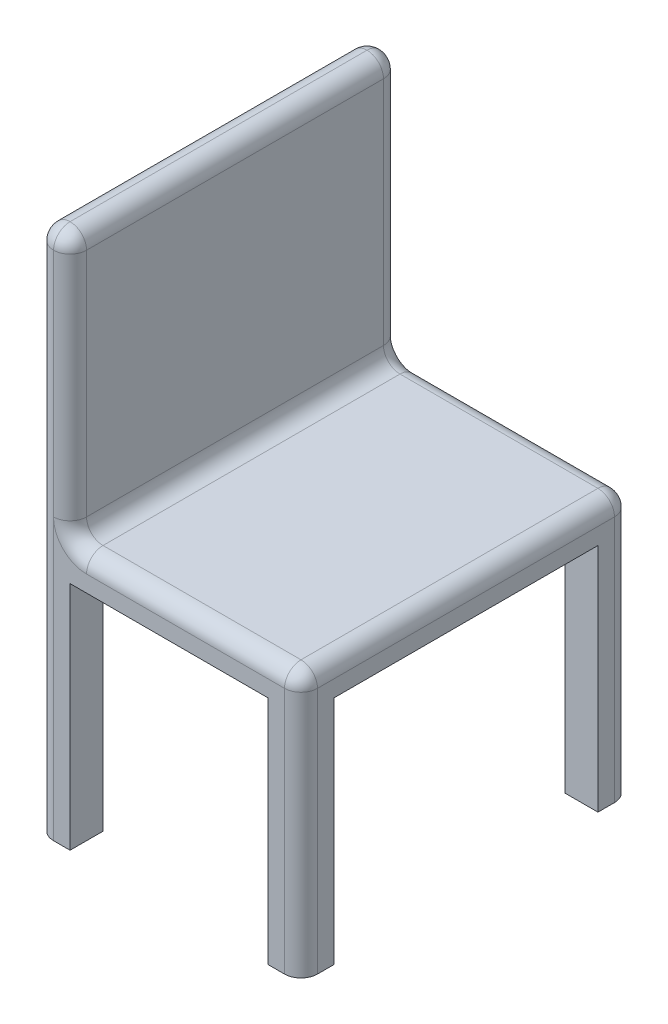
ISO-10303-21;
HEADER;
FILE_DESCRIPTION(('STEP AP214'),'2;1');
FILE_NAME('part.step','',(''),(''),'','','');
FILE_SCHEMA(('AUTOMOTIVE_DESIGN { 1 0 10303 214 1 1 1 1 }'));
ENDSEC;
DATA;
#1=APPLICATION_CONTEXT('core data for automotive mechanical design processes');
#2=APPLICATION_PROTOCOL_DEFINITION('international standard','automotive_design',2000,#1);
#3=PRODUCT_CONTEXT('',#1,'mechanical');
#4=PRODUCT('Part','Part','',(#3));
#5=PRODUCT_RELATED_PRODUCT_CATEGORY('part','',(#4));
#6=PRODUCT_DEFINITION_FORMATION('','',#4);
#7=PRODUCT_DEFINITION_CONTEXT('part definition',#1,'design');
#8=PRODUCT_DEFINITION('design','',#6,#7);
#9=PRODUCT_DEFINITION_SHAPE('','',#8);
#10=(LENGTH_UNIT() NAMED_UNIT(*) SI_UNIT(.MILLI.,.METRE.));
#11=(NAMED_UNIT(*) PLANE_ANGLE_UNIT() SI_UNIT($,.RADIAN.));
#12=(NAMED_UNIT(*) SI_UNIT($,.STERADIAN.) SOLID_ANGLE_UNIT());
#13=UNCERTAINTY_MEASURE_WITH_UNIT(LENGTH_MEASURE(1.E-05),#10,'distance_accuracy_value','');
#14=(GEOMETRIC_REPRESENTATION_CONTEXT(3) GLOBAL_UNCERTAINTY_ASSIGNED_CONTEXT((#13)) GLOBAL_UNIT_ASSIGNED_CONTEXT((#10,
#11,#12)) REPRESENTATION_CONTEXT('',''));
#15=CARTESIAN_POINT('',(0.,0.,0.));
#16=DIRECTION('',(0.,0.,1.));
#17=DIRECTION('',(1.,0.,0.));
#18=AXIS2_PLACEMENT_3D('',#15,#16,#17);
#19=CARTESIAN_POINT('',(1.,0.,10.));
#20=DIRECTION('',(0.,1.,0.));
#21=DIRECTION('',(-1.,0.,0.));
#22=AXIS2_PLACEMENT_3D('',#19,#20,#21);
#23=PLANE('',#22);
#24=DIRECTION('',(1.,0.,0.));
#25=VECTOR('',#24,1.);
#26=CARTESIAN_POINT('',(1.,0.,10.));
#27=LINE('',#26,#25);
#28=CARTESIAN_POINT('',(0.5,0.,10.));
#29=VERTEX_POINT('',#28);
#30=CARTESIAN_POINT('',(1.,0.,10.));
#31=VERTEX_POINT('',#30);
#32=EDGE_CURVE('E281',#29,#31,#27,.T.);
#33=ORIENTED_EDGE('',*,*,#32,.F.);
#34=CARTESIAN_POINT('',(0.5,0.,9.5));
#35=DIRECTION('',(0.,1.,0.));
#36=DIRECTION('',(-1.,0.,0.));
#37=AXIS2_PLACEMENT_3D('',#34,#35,#36);
#38=CIRCLE('',#37,0.5);
#39=CARTESIAN_POINT('',(0.,0.,9.5));
#40=VERTEX_POINT('',#39);
#41=EDGE_CURVE('E224',#29,#40,#38,.F.);
#42=ORIENTED_EDGE('',*,*,#41,.T.);
#43=DIRECTION('',(0.,0.,-1.));
#44=VECTOR('',#43,1.);
#45=CARTESIAN_POINT('',(0.,0.,10.));
#46=LINE('',#45,#44);
#47=CARTESIAN_POINT('',(0.,0.,9.));
#48=VERTEX_POINT('',#47);
#49=EDGE_CURVE('E217',#40,#48,#46,.T.);
#50=ORIENTED_EDGE('',*,*,#49,.T.);
#51=DIRECTION('',(1.,0.,0.));
#52=VECTOR('',#51,1.);
#53=CARTESIAN_POINT('',(0.,0.,9.));
#54=LINE('',#53,#52);
#55=CARTESIAN_POINT('',(1.,0.,9.));
#56=VERTEX_POINT('',#55);
#57=EDGE_CURVE('E221',#48,#56,#54,.T.);
#58=ORIENTED_EDGE('',*,*,#57,.T.);
#59=DIRECTION('',(0.,0.,-1.));
#60=VECTOR('',#59,1.);
#61=CARTESIAN_POINT('',(1.,0.,10.));
#62=LINE('',#61,#60);
#63=EDGE_CURVE('E320',#31,#56,#62,.T.);
#64=ORIENTED_EDGE('',*,*,#63,.F.);
#65=EDGE_LOOP('',(#33,#42,#50,#58,#64));
#66=FACE_BOUND('',#65,.T.);
#67=ADVANCED_FACE('F37',(#66),#23,.F.);
#68=CARTESIAN_POINT('',(1.,7.,10.));
#69=DIRECTION('',(-1.,0.,0.));
#70=DIRECTION('',(0.,-1.,0.));
#71=AXIS2_PLACEMENT_3D('',#68,#69,#70);
#72=PLANE('',#71);
#73=ORIENTED_EDGE('',*,*,#63,.T.);
#74=DIRECTION('',(0.,1.,0.));
#75=VECTOR('',#74,1.);
#76=CARTESIAN_POINT('',(1.,7.,9.));
#77=LINE('',#76,#75);
#78=CARTESIAN_POINT('',(1.,7.,9.));
#79=VERTEX_POINT('',#78);
#80=EDGE_CURVE('E238',#56,#79,#77,.T.);
#81=ORIENTED_EDGE('',*,*,#80,.T.);
#82=DIRECTION('',(0.,0.,-1.));
#83=VECTOR('',#82,1.);
#84=CARTESIAN_POINT('',(1.,7.,10.));
#85=LINE('',#84,#83);
#86=CARTESIAN_POINT('',(1.,7.,10.));
#87=VERTEX_POINT('',#86);
#88=EDGE_CURVE('E316',#87,#79,#85,.T.);
#89=ORIENTED_EDGE('',*,*,#88,.F.);
#90=DIRECTION('',(0.,1.,0.));
#91=VECTOR('',#90,1.);
#92=CARTESIAN_POINT('',(1.,7.,10.));
#93=LINE('',#92,#91);
#94=EDGE_CURVE('E283',#31,#87,#93,.T.);
#95=ORIENTED_EDGE('',*,*,#94,.F.);
#96=EDGE_LOOP('',(#73,#81,#89,#95));
#97=FACE_BOUND('',#96,.T.);
#98=ADVANCED_FACE('F476',(#97),#72,.F.);
#99=CARTESIAN_POINT('',(7.,0.,10.));
#100=DIRECTION('',(1.,0.,0.));
#101=DIRECTION('',(0.,0.,-1.));
#102=AXIS2_PLACEMENT_3D('',#99,#100,#101);
#103=PLANE('',#102);
#104=DIRECTION('',(0.,0.,-1.));
#105=VECTOR('',#104,1.);
#106=CARTESIAN_POINT('',(7.,7.,10.));
#107=LINE('',#106,#105);
#108=CARTESIAN_POINT('',(7.,7.,10.));
#109=VERTEX_POINT('',#108);
#110=CARTESIAN_POINT('',(7.,7.,9.));
#111=VERTEX_POINT('',#110);
#112=EDGE_CURVE('E312',#109,#111,#107,.T.);
#113=ORIENTED_EDGE('',*,*,#112,.T.);
#114=DIRECTION('',(0.,-1.,0.));
#115=VECTOR('',#114,1.);
#116=CARTESIAN_POINT('',(7.,0.,9.));
#117=LINE('',#116,#115);
#118=CARTESIAN_POINT('',(7.,0.,9.));
#119=VERTEX_POINT('',#118);
#120=EDGE_CURVE('E276',#111,#119,#117,.T.);
#121=ORIENTED_EDGE('',*,*,#120,.T.);
#122=DIRECTION('',(0.,0.,-1.));
#123=VECTOR('',#122,1.);
#124=CARTESIAN_POINT('',(7.,0.,10.));
#125=LINE('',#124,#123);
#126=CARTESIAN_POINT('',(7.,0.,10.));
#127=VERTEX_POINT('',#126);
#128=EDGE_CURVE('E308',#127,#119,#125,.T.);
#129=ORIENTED_EDGE('',*,*,#128,.F.);
#130=DIRECTION('',(0.,-1.,0.));
#131=VECTOR('',#130,1.);
#132=CARTESIAN_POINT('',(7.,0.,10.));
#133=LINE('',#132,#131);
#134=EDGE_CURVE('E288',#109,#127,#133,.T.);
#135=ORIENTED_EDGE('',*,*,#134,.F.);
#136=EDGE_LOOP('',(#113,#121,#129,#135));
#137=FACE_BOUND('',#136,.T.);
#138=ADVANCED_FACE('F482',(#137),#103,.F.);
#139=CARTESIAN_POINT('',(8.,0.,10.));
#140=DIRECTION('',(0.,1.,0.));
#141=DIRECTION('',(-1.,0.,0.));
#142=AXIS2_PLACEMENT_3D('',#139,#140,#141);
#143=PLANE('',#142);
#144=DIRECTION('',(0.,0.,-1.));
#145=VECTOR('',#144,1.);
#146=CARTESIAN_POINT('',(8.,0.,10.));
#147=LINE('',#146,#145);
#148=CARTESIAN_POINT('',(8.,0.,9.5));
#149=VERTEX_POINT('',#148);
#150=CARTESIAN_POINT('',(8.,0.,9.));
#151=VERTEX_POINT('',#150);
#152=EDGE_CURVE('E305',#149,#151,#147,.T.);
#153=ORIENTED_EDGE('',*,*,#152,.F.);
#154=CARTESIAN_POINT('',(7.5,0.,9.5));
#155=DIRECTION('',(0.,1.,0.));
#156=DIRECTION('',(-1.,0.,0.));
#157=AXIS2_PLACEMENT_3D('',#154,#155,#156);
#158=CIRCLE('',#157,0.5);
#159=CARTESIAN_POINT('',(7.5,0.,10.));
#160=VERTEX_POINT('',#159);
#161=EDGE_CURVE('E410',#149,#160,#158,.F.);
#162=ORIENTED_EDGE('',*,*,#161,.T.);
#163=DIRECTION('',(1.,0.,0.));
#164=VECTOR('',#163,1.);
#165=CARTESIAN_POINT('',(8.,0.,10.));
#166=LINE('',#165,#164);
#167=EDGE_CURVE('E290',#127,#160,#166,.T.);
#168=ORIENTED_EDGE('',*,*,#167,.F.);
#169=ORIENTED_EDGE('',*,*,#128,.T.);
#170=EDGE_CURVE('E240',#119,#151,#54,.T.);
#171=ORIENTED_EDGE('',*,*,#170,.T.);
#172=EDGE_LOOP('',(#153,#162,#168,#169,#171));
#173=FACE_BOUND('',#172,.T.);
#174=ADVANCED_FACE('F488',(#173),#143,.F.);
#175=CARTESIAN_POINT('',(0.,0.,1.));
#176=VERTEX_POINT('',#175);
#177=CARTESIAN_POINT('',(0.,0.,0.5));
#178=VERTEX_POINT('',#177);
#179=EDGE_CURVE('E230',#176,#178,#46,.T.);
#180=ORIENTED_EDGE('',*,*,#179,.T.);
#181=CARTESIAN_POINT('',(0.5,0.,0.5));
#182=DIRECTION('',(0.,1.,0.));
#183=DIRECTION('',(-1.,0.,0.));
#184=AXIS2_PLACEMENT_3D('',#181,#182,#183);
#185=CIRCLE('',#184,0.5);
#186=CARTESIAN_POINT('',(0.5,0.,0.));
#187=VERTEX_POINT('',#186);
#188=EDGE_CURVE('E394',#178,#187,#185,.F.);
#189=ORIENTED_EDGE('',*,*,#188,.T.);
#190=DIRECTION('',(1.,0.,0.));
#191=VECTOR('',#190,1.);
#192=CARTESIAN_POINT('',(1.,0.,0.));
#193=LINE('',#192,#191);
#194=CARTESIAN_POINT('',(1.,0.,0.));
#195=VERTEX_POINT('',#194);
#196=EDGE_CURVE('E280',#187,#195,#193,.T.);
#197=ORIENTED_EDGE('',*,*,#196,.T.);
#198=CARTESIAN_POINT('',(1.,0.,1.));
#199=VERTEX_POINT('',#198);
#200=EDGE_CURVE('E319',#199,#195,#62,.T.);
#201=ORIENTED_EDGE('',*,*,#200,.F.);
#202=DIRECTION('',(1.,0.,0.));
#203=VECTOR('',#202,1.);
#204=CARTESIAN_POINT('',(0.,0.,1.));
#205=LINE('',#204,#203);
#206=EDGE_CURVE('E269',#176,#199,#205,.T.);
#207=ORIENTED_EDGE('',*,*,#206,.F.);
#208=EDGE_LOOP('',(#180,#189,#197,#201,#207));
#209=FACE_BOUND('',#208,.T.);
#210=ADVANCED_FACE('F478',(#209),#23,.F.);
#211=CARTESIAN_POINT('',(1.,7.,1.));
#212=VERTEX_POINT('',#211);
#213=CARTESIAN_POINT('',(1.,7.,0.));
#214=VERTEX_POINT('',#213);
#215=EDGE_CURVE('E315',#212,#214,#85,.T.);
#216=ORIENTED_EDGE('',*,*,#215,.F.);
#217=DIRECTION('',(0.,-1.,0.));
#218=VECTOR('',#217,1.);
#219=CARTESIAN_POINT('',(1.,7.,1.));
#220=LINE('',#219,#218);
#221=EDGE_CURVE('E273',#212,#199,#220,.T.);
#222=ORIENTED_EDGE('',*,*,#221,.T.);
#223=ORIENTED_EDGE('',*,*,#200,.T.);
#224=DIRECTION('',(0.,1.,0.));
#225=VECTOR('',#224,1.);
#226=CARTESIAN_POINT('',(1.,7.,0.));
#227=LINE('',#226,#225);
#228=EDGE_CURVE('E294',#195,#214,#227,.T.);
#229=ORIENTED_EDGE('',*,*,#228,.T.);
#230=EDGE_LOOP('',(#216,#222,#223,#229));
#231=FACE_BOUND('',#230,.T.);
#232=ADVANCED_FACE('F485',(#231),#72,.F.);
#233=CARTESIAN_POINT('',(7.,7.,10.));
#234=DIRECTION('',(0.,1.,0.));
#235=DIRECTION('',(-1.,0.,0.));
#236=AXIS2_PLACEMENT_3D('',#233,#234,#235);
#237=PLANE('',#236);
#238=CARTESIAN_POINT('',(7.,7.,1.));
#239=VERTEX_POINT('',#238);
#240=CARTESIAN_POINT('',(7.,7.,0.));
#241=VERTEX_POINT('',#240);
#242=EDGE_CURVE('E311',#239,#241,#107,.T.);
#243=ORIENTED_EDGE('',*,*,#242,.F.);
#244=DIRECTION('',(1.,0.,0.));
#245=VECTOR('',#244,1.);
#246=CARTESIAN_POINT('',(0.,7.,1.));
#247=LINE('',#246,#245);
#248=CARTESIAN_POINT('',(8.,7.,1.));
#249=VERTEX_POINT('',#248);
#250=EDGE_CURVE('E268',#239,#249,#247,.T.);
#251=ORIENTED_EDGE('',*,*,#250,.T.);
#252=DIRECTION('',(0.,0.,1.));
#253=VECTOR('',#252,1.);
#254=CARTESIAN_POINT('',(8.,7.,9.));
#255=LINE('',#254,#253);
#256=CARTESIAN_POINT('',(8.,7.,9.));
#257=VERTEX_POINT('',#256);
#258=EDGE_CURVE('E247',#249,#257,#255,.T.);
#259=ORIENTED_EDGE('',*,*,#258,.T.);
#260=DIRECTION('',(1.,0.,0.));
#261=VECTOR('',#260,1.);
#262=CARTESIAN_POINT('',(0.,7.,9.));
#263=LINE('',#262,#261);
#264=EDGE_CURVE('E264',#111,#257,#263,.T.);
#265=ORIENTED_EDGE('',*,*,#264,.F.);
#266=ORIENTED_EDGE('',*,*,#112,.F.);
#267=DIRECTION('',(1.,0.,0.));
#268=VECTOR('',#267,1.);
#269=CARTESIAN_POINT('',(7.,7.,10.));
#270=LINE('',#269,#268);
#271=EDGE_CURVE('E286',#87,#109,#270,.T.);
#272=ORIENTED_EDGE('',*,*,#271,.F.);
#273=ORIENTED_EDGE('',*,*,#88,.T.);
#274=CARTESIAN_POINT('',(0.,7.,9.));
#275=VERTEX_POINT('',#274);
#276=EDGE_CURVE('E261',#275,#79,#263,.T.);
#277=ORIENTED_EDGE('',*,*,#276,.F.);
#278=DIRECTION('',(0.,0.,1.));
#279=VECTOR('',#278,1.);
#280=CARTESIAN_POINT('',(0.,7.,9.));
#281=LINE('',#280,#279);
#282=CARTESIAN_POINT('',(0.,7.,1.));
#283=VERTEX_POINT('',#282);
#284=EDGE_CURVE('E245',#283,#275,#281,.T.);
#285=ORIENTED_EDGE('',*,*,#284,.F.);
#286=EDGE_CURVE('E265',#283,#212,#247,.T.);
#287=ORIENTED_EDGE('',*,*,#286,.T.);
#288=ORIENTED_EDGE('',*,*,#215,.T.);
#289=DIRECTION('',(1.,0.,0.));
#290=VECTOR('',#289,1.);
#291=CARTESIAN_POINT('',(7.,7.,0.));
#292=LINE('',#291,#290);
#293=EDGE_CURVE('E297',#214,#241,#292,.T.);
#294=ORIENTED_EDGE('',*,*,#293,.T.);
#295=EDGE_LOOP('',(#243,#251,#259,#265,#266,#272,#273,#277,#285,#287,#288,#294));
#296=FACE_BOUND('',#295,.T.);
#297=ADVANCED_FACE('F494',(#296),#237,.F.);
#298=CARTESIAN_POINT('',(7.,0.,1.));
#299=VERTEX_POINT('',#298);
#300=CARTESIAN_POINT('',(7.,0.,0.));
#301=VERTEX_POINT('',#300);
#302=EDGE_CURVE('E307',#299,#301,#125,.T.);
#303=ORIENTED_EDGE('',*,*,#302,.F.);
#304=DIRECTION('',(0.,1.,0.));
#305=VECTOR('',#304,1.);
#306=CARTESIAN_POINT('',(7.,0.,1.));
#307=LINE('',#306,#305);
#308=EDGE_CURVE('E263',#299,#239,#307,.T.);
#309=ORIENTED_EDGE('',*,*,#308,.T.);
#310=ORIENTED_EDGE('',*,*,#242,.T.);
#311=DIRECTION('',(0.,-1.,0.));
#312=VECTOR('',#311,1.);
#313=CARTESIAN_POINT('',(7.,0.,0.));
#314=LINE('',#313,#312);
#315=EDGE_CURVE('E300',#241,#301,#314,.T.);
#316=ORIENTED_EDGE('',*,*,#315,.T.);
#317=EDGE_LOOP('',(#303,#309,#310,#316));
#318=FACE_BOUND('',#317,.T.);
#319=ADVANCED_FACE('F517',(#318),#103,.F.);
#320=DIRECTION('',(1.,0.,0.));
#321=VECTOR('',#320,1.);
#322=CARTESIAN_POINT('',(8.,0.,0.));
#323=LINE('',#322,#321);
#324=CARTESIAN_POINT('',(7.5,0.,0.));
#325=VERTEX_POINT('',#324);
#326=EDGE_CURVE('E284',#301,#325,#323,.T.);
#327=ORIENTED_EDGE('',*,*,#326,.T.);
#328=CARTESIAN_POINT('',(7.5,0.,0.5));
#329=DIRECTION('',(0.,1.,0.));
#330=DIRECTION('',(-1.,0.,0.));
#331=AXIS2_PLACEMENT_3D('',#328,#329,#330);
#332=CIRCLE('',#331,0.5);
#333=CARTESIAN_POINT('',(8.,0.,0.5));
#334=VERTEX_POINT('',#333);
#335=EDGE_CURVE('E412',#325,#334,#332,.F.);
#336=ORIENTED_EDGE('',*,*,#335,.T.);
#337=CARTESIAN_POINT('',(8.,0.,1.));
#338=VERTEX_POINT('',#337);
#339=EDGE_CURVE('E229',#338,#334,#147,.T.);
#340=ORIENTED_EDGE('',*,*,#339,.F.);
#341=EDGE_CURVE('E239',#299,#338,#205,.T.);
#342=ORIENTED_EDGE('',*,*,#341,.F.);
#343=ORIENTED_EDGE('',*,*,#302,.T.);
#344=EDGE_LOOP('',(#327,#336,#340,#342,#343));
#345=FACE_BOUND('',#344,.T.);
#346=ADVANCED_FACE('F498',(#345),#143,.F.);
#347=CARTESIAN_POINT('',(8.,8.,10.));
#348=DIRECTION('',(-1.,0.,0.));
#349=DIRECTION('',(0.,-1.,0.));
#350=AXIS2_PLACEMENT_3D('',#347,#348,#349);
#351=PLANE('',#350);
#352=DIRECTION('',(0.,0.,-1.));
#353=VECTOR('',#352,1.);
#354=CARTESIAN_POINT('',(8.,7.5,10.));
#355=LINE('',#354,#353);
#356=CARTESIAN_POINT('',(8.,7.5,0.5));
#357=VERTEX_POINT('',#356);
#358=CARTESIAN_POINT('',(8.,7.5,9.5));
#359=VERTEX_POINT('',#358);
#360=EDGE_CURVE('E354',#357,#359,#355,.F.);
#361=ORIENTED_EDGE('',*,*,#360,.T.);
#362=DIRECTION('',(0.,1.,0.));
#363=VECTOR('',#362,1.);
#364=CARTESIAN_POINT('',(8.,8.,9.5));
#365=LINE('',#364,#363);
#366=EDGE_CURVE('E408',#359,#149,#365,.F.);
#367=ORIENTED_EDGE('',*,*,#366,.T.);
#368=ORIENTED_EDGE('',*,*,#152,.T.);
#369=DIRECTION('',(0.,-1.,0.));
#370=VECTOR('',#369,1.);
#371=CARTESIAN_POINT('',(8.,0.,9.));
#372=LINE('',#371,#370);
#373=EDGE_CURVE('E255',#257,#151,#372,.T.);
#374=ORIENTED_EDGE('',*,*,#373,.F.);
#375=ORIENTED_EDGE('',*,*,#258,.F.);
#376=DIRECTION('',(0.,1.,0.));
#377=VECTOR('',#376,1.);
#378=CARTESIAN_POINT('',(8.,0.,1.));
#379=LINE('',#378,#377);
#380=EDGE_CURVE('E251',#338,#249,#379,.T.);
#381=ORIENTED_EDGE('',*,*,#380,.F.);
#382=ORIENTED_EDGE('',*,*,#339,.T.);
#383=DIRECTION('',(0.,1.,0.));
#384=VECTOR('',#383,1.);
#385=CARTESIAN_POINT('',(8.,7.5,0.5));
#386=LINE('',#385,#384);
#387=EDGE_CURVE('E406',#334,#357,#386,.T.);
#388=ORIENTED_EDGE('',*,*,#387,.T.);
#389=EDGE_LOOP('',(#361,#367,#368,#374,#375,#381,#382,#388));
#390=FACE_BOUND('',#389,.T.);
#391=ADVANCED_FACE('F528',(#390),#351,.F.);
#392=CARTESIAN_POINT('',(1.,8.,10.));
#393=DIRECTION('',(0.,-1.,0.));
#394=DIRECTION('',(0.,0.,-1.));
#395=AXIS2_PLACEMENT_3D('',#392,#393,#394);
#396=PLANE('',#395);
#397=DIRECTION('',(0.,0.,-1.));
#398=VECTOR('',#397,1.);
#399=CARTESIAN_POINT('',(1.5,8.,10.));
#400=LINE('',#399,#398);
#401=CARTESIAN_POINT('',(1.5,8.,0.5));
#402=VERTEX_POINT('',#401);
#403=CARTESIAN_POINT('',(1.5,8.,9.5));
#404=VERTEX_POINT('',#403);
#405=EDGE_CURVE('E349',#402,#404,#400,.F.);
#406=ORIENTED_EDGE('',*,*,#405,.T.);
#407=DIRECTION('',(-1.,0.,0.));
#408=VECTOR('',#407,1.);
#409=CARTESIAN_POINT('',(1.,8.,9.5));
#410=LINE('',#409,#408);
#411=CARTESIAN_POINT('',(7.5,8.,9.5));
#412=VERTEX_POINT('',#411);
#413=EDGE_CURVE('E351',#404,#412,#410,.F.);
#414=ORIENTED_EDGE('',*,*,#413,.T.);
#415=DIRECTION('',(0.,0.,-1.));
#416=VECTOR('',#415,1.);
#417=CARTESIAN_POINT('',(7.5,8.,10.));
#418=LINE('',#417,#416);
#419=CARTESIAN_POINT('',(7.5,8.,0.5));
#420=VERTEX_POINT('',#419);
#421=EDGE_CURVE('E346',#412,#420,#418,.T.);
#422=ORIENTED_EDGE('',*,*,#421,.T.);
#423=DIRECTION('',(-1.,0.,0.));
#424=VECTOR('',#423,1.);
#425=CARTESIAN_POINT('',(1.,8.,0.5));
#426=LINE('',#425,#424);
#427=EDGE_CURVE('E344',#420,#402,#426,.T.);
#428=ORIENTED_EDGE('',*,*,#427,.T.);
#429=EDGE_LOOP('',(#406,#414,#422,#428));
#430=FACE_BOUND('',#429,.T.);
#431=ADVANCED_FACE('F543',(#430),#396,.F.);
#432=CARTESIAN_POINT('',(1.,16.,10.));
#433=DIRECTION('',(-1.,0.,0.));
#434=DIRECTION('',(0.,-1.,0.));
#435=AXIS2_PLACEMENT_3D('',#432,#433,#434);
#436=PLANE('',#435);
#437=DIRECTION('',(0.,1.,0.));
#438=VECTOR('',#437,1.);
#439=CARTESIAN_POINT('',(1.,16.,0.5));
#440=LINE('',#439,#438);
#441=CARTESIAN_POINT('',(1.,8.5,0.5));
#442=VERTEX_POINT('',#441);
#443=CARTESIAN_POINT('',(1.,15.5,0.5));
#444=VERTEX_POINT('',#443);
#445=EDGE_CURVE('E332',#442,#444,#440,.T.);
#446=ORIENTED_EDGE('',*,*,#445,.T.);
#447=DIRECTION('',(0.,0.,-1.));
#448=VECTOR('',#447,1.);
#449=CARTESIAN_POINT('',(1.,15.5,10.));
#450=LINE('',#449,#448);
#451=CARTESIAN_POINT('',(1.,15.5,9.5));
#452=VERTEX_POINT('',#451);
#453=EDGE_CURVE('E428',#444,#452,#450,.F.);
#454=ORIENTED_EDGE('',*,*,#453,.T.);
#455=DIRECTION('',(0.,1.,0.));
#456=VECTOR('',#455,1.);
#457=CARTESIAN_POINT('',(1.,16.,9.5));
#458=LINE('',#457,#456);
#459=CARTESIAN_POINT('',(1.,8.5,9.5));
#460=VERTEX_POINT('',#459);
#461=EDGE_CURVE('E334',#452,#460,#458,.F.);
#462=ORIENTED_EDGE('',*,*,#461,.T.);
#463=DIRECTION('',(0.,0.,-1.));
#464=VECTOR('',#463,1.);
#465=CARTESIAN_POINT('',(1.,8.5,0.));
#466=LINE('',#465,#464);
#467=EDGE_CURVE('E330',#460,#442,#466,.T.);
#468=ORIENTED_EDGE('',*,*,#467,.T.);
#469=EDGE_LOOP('',(#446,#454,#462,#468));
#470=FACE_BOUND('',#469,.T.);
#471=ADVANCED_FACE('F594',(#470),#436,.F.);
#472=CARTESIAN_POINT('',(0.,0.,10.));
#473=DIRECTION('',(1.,0.,0.));
#474=DIRECTION('',(0.,0.,-1.));
#475=AXIS2_PLACEMENT_3D('',#472,#473,#474);
#476=PLANE('',#475);
#477=DIRECTION('',(0.,0.,-1.));
#478=VECTOR('',#477,1.);
#479=CARTESIAN_POINT('',(0.,15.5,10.));
#480=LINE('',#479,#478);
#481=CARTESIAN_POINT('',(0.,15.5,9.5));
#482=VERTEX_POINT('',#481);
#483=CARTESIAN_POINT('',(0.,15.5,0.5));
#484=VERTEX_POINT('',#483);
#485=EDGE_CURVE('E387',#482,#484,#480,.T.);
#486=ORIENTED_EDGE('',*,*,#485,.T.);
#487=DIRECTION('',(0.,-1.,0.));
#488=VECTOR('',#487,1.);
#489=CARTESIAN_POINT('',(0.,0.,0.5));
#490=LINE('',#489,#488);
#491=EDGE_CURVE('E389',#484,#178,#490,.T.);
#492=ORIENTED_EDGE('',*,*,#491,.T.);
#493=ORIENTED_EDGE('',*,*,#179,.F.);
#494=DIRECTION('',(0.,1.,0.));
#495=VECTOR('',#494,1.);
#496=CARTESIAN_POINT('',(0.,0.,1.));
#497=LINE('',#496,#495);
#498=EDGE_CURVE('E246',#176,#283,#497,.T.);
#499=ORIENTED_EDGE('',*,*,#498,.T.);
#500=ORIENTED_EDGE('',*,*,#284,.T.);
#501=DIRECTION('',(0.,-1.,0.));
#502=VECTOR('',#501,1.);
#503=CARTESIAN_POINT('',(0.,0.,9.));
#504=LINE('',#503,#502);
#505=EDGE_CURVE('E235',#275,#48,#504,.T.);
#506=ORIENTED_EDGE('',*,*,#505,.T.);
#507=ORIENTED_EDGE('',*,*,#49,.F.);
#508=DIRECTION('',(0.,-1.,0.));
#509=VECTOR('',#508,1.);
#510=CARTESIAN_POINT('',(0.,0.,9.5));
#511=LINE('',#510,#509);
#512=EDGE_CURVE('E385',#40,#482,#511,.F.);
#513=ORIENTED_EDGE('',*,*,#512,.T.);
#514=EDGE_LOOP('',(#486,#492,#493,#499,#500,#506,#507,#513));
#515=FACE_BOUND('',#514,.T.);
#516=ADVANCED_FACE('F243',(#515),#476,.F.);
#517=CARTESIAN_POINT('',(0.,0.,10.));
#518=DIRECTION('',(0.,0.,-1.));
#519=DIRECTION('',(-1.,0.,0.));
#520=AXIS2_PLACEMENT_3D('',#517,#518,#519);
#521=PLANE('',#520);
#522=CARTESIAN_POINT('',(1.5,8.5,10.));
#523=DIRECTION('',(0.,0.,-1.));
#524=DIRECTION('',(-1.,0.,0.));
#525=AXIS2_PLACEMENT_3D('',#522,#523,#524);
#526=CIRCLE('',#525,1.);
#527=CARTESIAN_POINT('',(0.500000000000001,8.5,10.));
#528=VERTEX_POINT('',#527);
#529=CARTESIAN_POINT('',(1.5,7.5,10.));
#530=VERTEX_POINT('',#529);
#531=EDGE_CURVE('E322',#528,#530,#526,.F.);
#532=ORIENTED_EDGE('',*,*,#531,.F.);
#533=DIRECTION('',(0.,-1.,0.));
#534=VECTOR('',#533,1.);
#535=CARTESIAN_POINT('',(0.5,0.,10.));
#536=LINE('',#535,#534);
#537=EDGE_CURVE('E403',#528,#29,#536,.T.);
#538=ORIENTED_EDGE('',*,*,#537,.T.);
#539=ORIENTED_EDGE('',*,*,#32,.T.);
#540=ORIENTED_EDGE('',*,*,#94,.T.);
#541=ORIENTED_EDGE('',*,*,#271,.T.);
#542=ORIENTED_EDGE('',*,*,#134,.T.);
#543=ORIENTED_EDGE('',*,*,#167,.T.);
#544=DIRECTION('',(0.,1.,0.));
#545=VECTOR('',#544,1.);
#546=CARTESIAN_POINT('',(7.5,0.,10.));
#547=LINE('',#546,#545);
#548=CARTESIAN_POINT('',(7.5,7.5,10.));
#549=VERTEX_POINT('',#548);
#550=EDGE_CURVE('E401',#160,#549,#547,.T.);
#551=ORIENTED_EDGE('',*,*,#550,.T.);
#552=DIRECTION('',(-1.,0.,0.));
#553=VECTOR('',#552,1.);
#554=CARTESIAN_POINT('',(0.,7.5,10.));
#555=LINE('',#554,#553);
#556=EDGE_CURVE('E325',#549,#530,#555,.T.);
#557=ORIENTED_EDGE('',*,*,#556,.T.);
#558=EDGE_LOOP('',(#532,#538,#539,#540,#541,#542,#543,#551,#557));
#559=FACE_BOUND('',#558,.T.);
#560=ADVANCED_FACE('F575',(#559),#521,.F.);
#561=CARTESIAN_POINT('',(0.,0.,0.));
#562=DIRECTION('',(0.,0.,-1.));
#563=DIRECTION('',(-1.,0.,0.));
#564=AXIS2_PLACEMENT_3D('',#561,#562,#563);
#565=PLANE('',#564);
#566=ORIENTED_EDGE('',*,*,#196,.F.);
#567=DIRECTION('',(0.,-1.,0.));
#568=VECTOR('',#567,1.);
#569=CARTESIAN_POINT('',(0.5,16.,0.));
#570=LINE('',#569,#568);
#571=CARTESIAN_POINT('',(0.500000000000001,8.5,0.));
#572=VERTEX_POINT('',#571);
#573=EDGE_CURVE('E398',#187,#572,#570,.F.);
#574=ORIENTED_EDGE('',*,*,#573,.T.);
#575=CARTESIAN_POINT('',(1.5,8.5,0.));
#576=DIRECTION('',(0.,0.,-1.));
#577=DIRECTION('',(-1.,0.,0.));
#578=AXIS2_PLACEMENT_3D('',#575,#576,#577);
#579=CIRCLE('',#578,1.);
#580=CARTESIAN_POINT('',(1.5,7.5,0.));
#581=VERTEX_POINT('',#580);
#582=EDGE_CURVE('E339',#581,#572,#579,.T.);
#583=ORIENTED_EDGE('',*,*,#582,.F.);
#584=DIRECTION('',(-1.,0.,0.));
#585=VECTOR('',#584,1.);
#586=CARTESIAN_POINT('',(8.,7.5,0.));
#587=LINE('',#586,#585);
#588=CARTESIAN_POINT('',(7.5,7.5,0.));
#589=VERTEX_POINT('',#588);
#590=EDGE_CURVE('E336',#581,#589,#587,.F.);
#591=ORIENTED_EDGE('',*,*,#590,.T.);
#592=DIRECTION('',(0.,1.,0.));
#593=VECTOR('',#592,1.);
#594=CARTESIAN_POINT('',(7.5,0.,0.));
#595=LINE('',#594,#593);
#596=EDGE_CURVE('E396',#589,#325,#595,.F.);
#597=ORIENTED_EDGE('',*,*,#596,.T.);
#598=ORIENTED_EDGE('',*,*,#326,.F.);
#599=ORIENTED_EDGE('',*,*,#315,.F.);
#600=ORIENTED_EDGE('',*,*,#293,.F.);
#601=ORIENTED_EDGE('',*,*,#228,.F.);
#602=EDGE_LOOP('',(#566,#574,#583,#591,#597,#598,#599,#600,#601));
#603=FACE_BOUND('',#602,.T.);
#604=ADVANCED_FACE('F513',(#603),#565,.T.);
#605=CARTESIAN_POINT('',(0.,0.,1.));
#606=DIRECTION('',(0.,0.,-1.));
#607=DIRECTION('',(-1.,0.,0.));
#608=AXIS2_PLACEMENT_3D('',#605,#606,#607);
#609=PLANE('',#608);
#610=ORIENTED_EDGE('',*,*,#286,.F.);
#611=ORIENTED_EDGE('',*,*,#498,.F.);
#612=ORIENTED_EDGE('',*,*,#206,.T.);
#613=ORIENTED_EDGE('',*,*,#221,.F.);
#614=EDGE_LOOP('',(#610,#611,#612,#613));
#615=FACE_BOUND('',#614,.T.);
#616=ADVANCED_FACE('F504',(#615),#609,.F.);
#617=CARTESIAN_POINT('',(0.,0.,9.));
#618=DIRECTION('',(0.,0.,1.));
#619=DIRECTION('',(1.,0.,0.));
#620=AXIS2_PLACEMENT_3D('',#617,#618,#619);
#621=PLANE('',#620);
#622=ORIENTED_EDGE('',*,*,#57,.F.);
#623=ORIENTED_EDGE('',*,*,#505,.F.);
#624=ORIENTED_EDGE('',*,*,#276,.T.);
#625=ORIENTED_EDGE('',*,*,#80,.F.);
#626=EDGE_LOOP('',(#622,#623,#624,#625));
#627=FACE_BOUND('',#626,.T.);
#628=ADVANCED_FACE('F234',(#627),#621,.F.);
#629=ORIENTED_EDGE('',*,*,#264,.T.);
#630=ORIENTED_EDGE('',*,*,#373,.T.);
#631=ORIENTED_EDGE('',*,*,#170,.F.);
#632=ORIENTED_EDGE('',*,*,#120,.F.);
#633=EDGE_LOOP('',(#629,#630,#631,#632));
#634=FACE_BOUND('',#633,.T.);
#635=ADVANCED_FACE('F582',(#634),#621,.F.);
#636=ORIENTED_EDGE('',*,*,#341,.T.);
#637=ORIENTED_EDGE('',*,*,#380,.T.);
#638=ORIENTED_EDGE('',*,*,#250,.F.);
#639=ORIENTED_EDGE('',*,*,#308,.F.);
#640=EDGE_LOOP('',(#636,#637,#638,#639));
#641=FACE_BOUND('',#640,.T.);
#642=ADVANCED_FACE('F520',(#641),#609,.F.);
#643=CARTESIAN_POINT('',(0.5,16.,0.5));
#644=DIRECTION('',(0.,-1.,0.));
#645=DIRECTION('',(1.,0.,0.));
#646=AXIS2_PLACEMENT_3D('',#643,#644,#645);
#647=CYLINDRICAL_SURFACE('',#646,0.5);
#648=DIRECTION('',(0.,1.,0.));
#649=VECTOR('',#648,1.);
#650=CARTESIAN_POINT('',(0.500000000000001,8.,0.));
#651=LINE('',#650,#649);
#652=CARTESIAN_POINT('',(0.5,15.5,0.));
#653=VERTEX_POINT('',#652);
#654=EDGE_CURVE('E342',#653,#572,#651,.F.);
#655=ORIENTED_EDGE('',*,*,#654,.F.);
#656=CARTESIAN_POINT('',(0.5,15.5,0.5));
#657=DIRECTION('',(0.,-1.,0.));
#658=DIRECTION('',(1.,0.,0.));
#659=AXIS2_PLACEMENT_3D('',#656,#657,#658);
#660=CIRCLE('',#659,0.5);
#661=EDGE_CURVE('E11',#653,#444,#660,.T.);
#662=ORIENTED_EDGE('',*,*,#661,.T.);
#663=ORIENTED_EDGE('',*,*,#445,.F.);
#664=CARTESIAN_POINT('',(0.500000000000001,8.5,0.5));
#665=DIRECTION('',(0.,-1.,0.));
#666=DIRECTION('',(0.,0.,-1.));
#667=AXIS2_PLACEMENT_3D('',#664,#665,#666);
#668=CIRCLE('',#667,0.5);
#669=EDGE_CURVE('E258',#572,#442,#668,.T.);
#670=ORIENTED_EDGE('',*,*,#669,.F.);
#671=EDGE_LOOP('',(#655,#662,#663,#670));
#672=FACE_BOUND('',#671,.T.);
#673=ADVANCED_FACE('F595',(#672),#647,.T.);
#674=CARTESIAN_POINT('',(1.,7.5,0.5));
#675=DIRECTION('',(1.,0.,0.));
#676=DIRECTION('',(0.,0.,-1.));
#677=AXIS2_PLACEMENT_3D('',#674,#675,#676);
#678=CYLINDRICAL_SURFACE('',#677,0.5);
#679=ORIENTED_EDGE('',*,*,#427,.F.);
#680=CARTESIAN_POINT('',(7.5,7.5,0.5));
#681=DIRECTION('',(1.,0.,0.));
#682=DIRECTION('',(0.,0.,-1.));
#683=AXIS2_PLACEMENT_3D('',#680,#681,#682);
#684=CIRCLE('',#683,0.5);
#685=EDGE_CURVE('E383',#420,#589,#684,.F.);
#686=ORIENTED_EDGE('',*,*,#685,.T.);
#687=ORIENTED_EDGE('',*,*,#590,.F.);
#688=CARTESIAN_POINT('',(1.5,7.5,0.5));
#689=DIRECTION('',(-1.,0.,0.));
#690=DIRECTION('',(0.,0.,1.));
#691=AXIS2_PLACEMENT_3D('',#688,#689,#690);
#692=CIRCLE('',#691,0.5);
#693=EDGE_CURVE('E371',#402,#581,#692,.T.);
#694=ORIENTED_EDGE('',*,*,#693,.F.);
#695=EDGE_LOOP('',(#679,#686,#687,#694));
#696=FACE_BOUND('',#695,.T.);
#697=ADVANCED_FACE('F547',(#696),#678,.T.);
#698=CARTESIAN_POINT('',(1.5,8.5,0.5));
#699=DIRECTION('',(0.,0.,-1.));
#700=DIRECTION('',(-1.,0.,0.));
#701=AXIS2_PLACEMENT_3D('',#698,#699,#700);
#702=TOROIDAL_SURFACE('',#701,1.,0.5);
#703=ORIENTED_EDGE('',*,*,#582,.T.);
#704=ORIENTED_EDGE('',*,*,#669,.T.);
#705=CARTESIAN_POINT('',(1.5,8.5,0.5));
#706=DIRECTION('',(0.,0.,-1.));
#707=DIRECTION('',(-1.,0.,0.));
#708=AXIS2_PLACEMENT_3D('',#705,#706,#707);
#709=CIRCLE('',#708,0.5);
#710=EDGE_CURVE('E368',#402,#442,#709,.T.);
#711=ORIENTED_EDGE('',*,*,#710,.F.);
#712=ORIENTED_EDGE('',*,*,#693,.T.);
#713=EDGE_LOOP('',(#703,#704,#711,#712));
#714=FACE_BOUND('',#713,.T.);
#715=ADVANCED_FACE('F552',(#714),#702,.T.);
#716=CARTESIAN_POINT('',(7.5,7.5,10.));
#717=DIRECTION('',(0.,0.,-1.));
#718=DIRECTION('',(-1.,0.,0.));
#719=AXIS2_PLACEMENT_3D('',#716,#717,#718);
#720=CYLINDRICAL_SURFACE('',#719,0.5);
#721=ORIENTED_EDGE('',*,*,#421,.F.);
#722=CARTESIAN_POINT('',(7.5,7.5,9.5));
#723=DIRECTION('',(0.,0.,-1.));
#724=DIRECTION('',(-1.,0.,0.));
#725=AXIS2_PLACEMENT_3D('',#722,#723,#724);
#726=CIRCLE('',#725,0.5);
#727=EDGE_CURVE('E381',#412,#359,#726,.T.);
#728=ORIENTED_EDGE('',*,*,#727,.T.);
#729=ORIENTED_EDGE('',*,*,#360,.F.);
#730=CARTESIAN_POINT('',(7.5,7.5,0.5));
#731=DIRECTION('',(0.,0.,-1.));
#732=DIRECTION('',(-1.,0.,0.));
#733=AXIS2_PLACEMENT_3D('',#730,#731,#732);
#734=CIRCLE('',#733,0.5);
#735=EDGE_CURVE('E378',#357,#420,#734,.F.);
#736=ORIENTED_EDGE('',*,*,#735,.T.);
#737=EDGE_LOOP('',(#721,#728,#729,#736));
#738=FACE_BOUND('',#737,.T.);
#739=ADVANCED_FACE('F540',(#738),#720,.T.);
#740=CARTESIAN_POINT('',(1.5,8.5,10.));
#741=DIRECTION('',(0.,0.,1.));
#742=DIRECTION('',(1.,0.,0.));
#743=AXIS2_PLACEMENT_3D('',#740,#741,#742);
#744=CYLINDRICAL_SURFACE('',#743,0.5);
#745=ORIENTED_EDGE('',*,*,#710,.T.);
#746=ORIENTED_EDGE('',*,*,#467,.F.);
#747=CARTESIAN_POINT('',(1.5,8.5,9.5));
#748=DIRECTION('',(0.,0.,-1.));
#749=DIRECTION('',(-1.,0.,0.));
#750=AXIS2_PLACEMENT_3D('',#747,#748,#749);
#751=CIRCLE('',#750,0.5);
#752=EDGE_CURVE('E365',#404,#460,#751,.T.);
#753=ORIENTED_EDGE('',*,*,#752,.F.);
#754=ORIENTED_EDGE('',*,*,#405,.F.);
#755=EDGE_LOOP('',(#745,#746,#753,#754));
#756=FACE_BOUND('',#755,.T.);
#757=ADVANCED_FACE('F557',(#756),#744,.F.);
#758=CARTESIAN_POINT('',(0.,7.5,9.5));
#759=DIRECTION('',(-1.,0.,0.));
#760=DIRECTION('',(0.,0.,1.));
#761=AXIS2_PLACEMENT_3D('',#758,#759,#760);
#762=CYLINDRICAL_SURFACE('',#761,0.5);
#763=ORIENTED_EDGE('',*,*,#556,.F.);
#764=CARTESIAN_POINT('',(7.5,7.5,9.5));
#765=DIRECTION('',(-1.,0.,0.));
#766=DIRECTION('',(0.,0.,1.));
#767=AXIS2_PLACEMENT_3D('',#764,#765,#766);
#768=CIRCLE('',#767,0.5);
#769=EDGE_CURVE('E357',#549,#412,#768,.T.);
#770=ORIENTED_EDGE('',*,*,#769,.T.);
#771=ORIENTED_EDGE('',*,*,#413,.F.);
#772=CARTESIAN_POINT('',(1.5,7.5,9.5));
#773=DIRECTION('',(-1.,0.,0.));
#774=DIRECTION('',(0.,0.,1.));
#775=AXIS2_PLACEMENT_3D('',#772,#773,#774);
#776=CIRCLE('',#775,0.5);
#777=EDGE_CURVE('E361',#530,#404,#776,.T.);
#778=ORIENTED_EDGE('',*,*,#777,.F.);
#779=EDGE_LOOP('',(#763,#770,#771,#778));
#780=FACE_BOUND('',#779,.T.);
#781=ADVANCED_FACE('F561',(#780),#762,.T.);
#782=CARTESIAN_POINT('',(1.5,8.5,9.5));
#783=DIRECTION('',(0.,0.,-1.));
#784=DIRECTION('',(-1.,0.,0.));
#785=AXIS2_PLACEMENT_3D('',#782,#783,#784);
#786=TOROIDAL_SURFACE('',#785,1.,0.5);
#787=ORIENTED_EDGE('',*,*,#777,.T.);
#788=ORIENTED_EDGE('',*,*,#752,.T.);
#789=CARTESIAN_POINT('',(0.500000000000001,8.5,9.5));
#790=DIRECTION('',(0.,-1.,0.));
#791=DIRECTION('',(0.,0.,-1.));
#792=AXIS2_PLACEMENT_3D('',#789,#790,#791);
#793=CIRCLE('',#792,0.5);
#794=EDGE_CURVE('E358',#528,#460,#793,.F.);
#795=ORIENTED_EDGE('',*,*,#794,.F.);
#796=ORIENTED_EDGE('',*,*,#531,.T.);
#797=EDGE_LOOP('',(#787,#788,#795,#796));
#798=FACE_BOUND('',#797,.T.);
#799=ADVANCED_FACE('F589',(#798),#786,.T.);
#800=CARTESIAN_POINT('',(0.500000000000002,0.,9.5));
#801=DIRECTION('',(0.,1.,0.));
#802=DIRECTION('',(-1.,0.,0.));
#803=AXIS2_PLACEMENT_3D('',#800,#801,#802);
#804=CYLINDRICAL_SURFACE('',#803,0.5);
#805=ORIENTED_EDGE('',*,*,#461,.F.);
#806=CARTESIAN_POINT('',(0.5,15.5,9.5));
#807=DIRECTION('',(0.,1.,0.));
#808=DIRECTION('',(-1.,0.,0.));
#809=AXIS2_PLACEMENT_3D('',#806,#807,#808);
#810=CIRCLE('',#809,0.5);
#811=CARTESIAN_POINT('',(0.5,15.5,10.));
#812=VERTEX_POINT('',#811);
#813=EDGE_CURVE('E426',#452,#812,#810,.F.);
#814=ORIENTED_EDGE('',*,*,#813,.T.);
#815=DIRECTION('',(0.,1.,0.));
#816=VECTOR('',#815,1.);
#817=CARTESIAN_POINT('',(0.500000000000002,0.,10.));
#818=LINE('',#817,#816);
#819=EDGE_CURVE('E327',#528,#812,#818,.T.);
#820=ORIENTED_EDGE('',*,*,#819,.F.);
#821=ORIENTED_EDGE('',*,*,#794,.T.);
#822=EDGE_LOOP('',(#805,#814,#820,#821));
#823=FACE_BOUND('',#822,.T.);
#824=ADVANCED_FACE('F592',(#823),#804,.T.);
#825=CARTESIAN_POINT('',(7.5,0.,9.5));
#826=DIRECTION('',(0.,1.,0.));
#827=DIRECTION('',(-1.,0.,0.));
#828=AXIS2_PLACEMENT_3D('',#825,#826,#827);
#829=CYLINDRICAL_SURFACE('',#828,0.5);
#830=ORIENTED_EDGE('',*,*,#161,.F.);
#831=ORIENTED_EDGE('',*,*,#366,.F.);
#832=CARTESIAN_POINT('',(7.5,7.5,9.5));
#833=DIRECTION('',(0.,1.,0.));
#834=DIRECTION('',(0.,0.,1.));
#835=AXIS2_PLACEMENT_3D('',#832,#833,#834);
#836=CIRCLE('',#835,0.5);
#837=EDGE_CURVE('E362',#549,#359,#836,.T.);
#838=ORIENTED_EDGE('',*,*,#837,.F.);
#839=ORIENTED_EDGE('',*,*,#550,.F.);
#840=EDGE_LOOP('',(#830,#831,#838,#839));
#841=FACE_BOUND('',#840,.T.);
#842=ADVANCED_FACE('F570',(#841),#829,.T.);
#843=CARTESIAN_POINT('',(7.5,7.5,9.5));
#844=DIRECTION('',(0.,0.,1.));
#845=DIRECTION('',(1.,0.,0.));
#846=AXIS2_PLACEMENT_3D('',#843,#844,#845);
#847=SPHERICAL_SURFACE('',#846,0.5);
#848=ORIENTED_EDGE('',*,*,#837,.T.);
#849=ORIENTED_EDGE('',*,*,#727,.F.);
#850=ORIENTED_EDGE('',*,*,#769,.F.);
#851=EDGE_LOOP('',(#848,#849,#850));
#852=FACE_BOUND('',#851,.T.);
#853=ADVANCED_FACE('F565',(#852),#847,.T.);
#854=CARTESIAN_POINT('',(7.5,8.,0.5));
#855=DIRECTION('',(0.,-1.,0.));
#856=DIRECTION('',(1.,0.,0.));
#857=AXIS2_PLACEMENT_3D('',#854,#855,#856);
#858=CYLINDRICAL_SURFACE('',#857,0.5);
#859=ORIENTED_EDGE('',*,*,#335,.F.);
#860=ORIENTED_EDGE('',*,*,#596,.F.);
#861=CARTESIAN_POINT('',(7.5,7.5,0.5));
#862=DIRECTION('',(0.,1.,0.));
#863=DIRECTION('',(0.,0.,1.));
#864=AXIS2_PLACEMENT_3D('',#861,#862,#863);
#865=CIRCLE('',#864,0.5);
#866=EDGE_CURVE('E417',#357,#589,#865,.T.);
#867=ORIENTED_EDGE('',*,*,#866,.F.);
#868=ORIENTED_EDGE('',*,*,#387,.F.);
#869=EDGE_LOOP('',(#859,#860,#867,#868));
#870=FACE_BOUND('',#869,.T.);
#871=ADVANCED_FACE('F533',(#870),#858,.T.);
#872=CARTESIAN_POINT('',(7.5,7.5,0.5));
#873=DIRECTION('',(0.,0.,1.));
#874=DIRECTION('',(1.,0.,0.));
#875=AXIS2_PLACEMENT_3D('',#872,#873,#874);
#876=SPHERICAL_SURFACE('',#875,0.5);
#877=ORIENTED_EDGE('',*,*,#866,.T.);
#878=ORIENTED_EDGE('',*,*,#685,.F.);
#879=ORIENTED_EDGE('',*,*,#735,.F.);
#880=EDGE_LOOP('',(#877,#878,#879));
#881=FACE_BOUND('',#880,.T.);
#882=ADVANCED_FACE('F537',(#881),#876,.T.);
#883=CARTESIAN_POINT('',(0.5,0.,9.5));
#884=DIRECTION('',(0.,-1.,0.));
#885=DIRECTION('',(0.,0.,-1.));
#886=AXIS2_PLACEMENT_3D('',#883,#884,#885);
#887=CYLINDRICAL_SURFACE('',#886,0.5);
#888=ORIENTED_EDGE('',*,*,#819,.T.);
#889=CARTESIAN_POINT('',(0.5,15.5,9.5));
#890=DIRECTION('',(0.,-1.,0.));
#891=DIRECTION('',(0.,0.,-1.));
#892=AXIS2_PLACEMENT_3D('',#889,#890,#891);
#893=CIRCLE('',#892,0.5);
#894=EDGE_CURVE('E424',#812,#482,#893,.T.);
#895=ORIENTED_EDGE('',*,*,#894,.T.);
#896=ORIENTED_EDGE('',*,*,#512,.F.);
#897=ORIENTED_EDGE('',*,*,#41,.F.);
#898=ORIENTED_EDGE('',*,*,#537,.F.);
#899=EDGE_LOOP('',(#888,#895,#896,#897,#898));
#900=FACE_BOUND('',#899,.T.);
#901=ADVANCED_FACE('F456',(#900),#887,.T.);
#902=CARTESIAN_POINT('',(0.5,0.,0.5));
#903=DIRECTION('',(0.,1.,0.));
#904=DIRECTION('',(0.,0.,1.));
#905=AXIS2_PLACEMENT_3D('',#902,#903,#904);
#906=CYLINDRICAL_SURFACE('',#905,0.5);
#907=ORIENTED_EDGE('',*,*,#491,.F.);
#908=CARTESIAN_POINT('',(0.5,15.5,0.5));
#909=DIRECTION('',(0.,1.,0.));
#910=DIRECTION('',(0.,0.,1.));
#911=AXIS2_PLACEMENT_3D('',#908,#909,#910);
#912=CIRCLE('',#911,0.5);
#913=EDGE_CURVE('E46',#484,#653,#912,.F.);
#914=ORIENTED_EDGE('',*,*,#913,.T.);
#915=ORIENTED_EDGE('',*,*,#654,.T.);
#916=ORIENTED_EDGE('',*,*,#573,.F.);
#917=ORIENTED_EDGE('',*,*,#188,.F.);
#918=EDGE_LOOP('',(#907,#914,#915,#916,#917));
#919=FACE_BOUND('',#918,.T.);
#920=ADVANCED_FACE('F451',(#919),#906,.T.);
#921=CARTESIAN_POINT('',(0.5,15.5,10.));
#922=DIRECTION('',(0.,0.,-1.));
#923=DIRECTION('',(-1.,0.,0.));
#924=AXIS2_PLACEMENT_3D('',#921,#922,#923);
#925=CYLINDRICAL_SURFACE('',#924,0.5);
#926=ORIENTED_EDGE('',*,*,#485,.F.);
#927=CARTESIAN_POINT('',(0.5,15.5,9.5));
#928=DIRECTION('',(0.,0.,-1.));
#929=DIRECTION('',(-1.,0.,0.));
#930=AXIS2_PLACEMENT_3D('',#927,#928,#929);
#931=CIRCLE('',#930,0.5);
#932=CARTESIAN_POINT('',(0.5,16.,9.5));
#933=VERTEX_POINT('',#932);
#934=EDGE_CURVE('E421',#482,#933,#931,.T.);
#935=ORIENTED_EDGE('',*,*,#934,.T.);
#936=DIRECTION('',(0.,0.,-1.));
#937=VECTOR('',#936,1.);
#938=CARTESIAN_POINT('',(0.5,16.,10.));
#939=LINE('',#938,#937);
#940=CARTESIAN_POINT('',(0.5,16.,0.5));
#941=VERTEX_POINT('',#940);
#942=EDGE_CURVE('E391',#941,#933,#939,.F.);
#943=ORIENTED_EDGE('',*,*,#942,.F.);
#944=CARTESIAN_POINT('',(0.5,15.5,0.5));
#945=DIRECTION('',(0.,0.,-1.));
#946=DIRECTION('',(-1.,0.,0.));
#947=AXIS2_PLACEMENT_3D('',#944,#945,#946);
#948=CIRCLE('',#947,0.5);
#949=EDGE_CURVE('E414',#941,#484,#948,.F.);
#950=ORIENTED_EDGE('',*,*,#949,.T.);
#951=EDGE_LOOP('',(#926,#935,#943,#950));
#952=FACE_BOUND('',#951,.T.);
#953=ADVANCED_FACE('F448',(#952),#925,.T.);
#954=CARTESIAN_POINT('',(0.5,15.5,0.5));
#955=DIRECTION('',(0.,0.,1.));
#956=DIRECTION('',(1.,0.,0.));
#957=AXIS2_PLACEMENT_3D('',#954,#955,#956);
#958=SPHERICAL_SURFACE('',#957,0.5);
#959=CARTESIAN_POINT('',(0.5,15.5,0.5));
#960=DIRECTION('',(1.,0.,0.));
#961=DIRECTION('',(0.,0.,-1.));
#962=AXIS2_PLACEMENT_3D('',#959,#960,#961);
#963=CIRCLE('',#962,0.5);
#964=EDGE_CURVE('E41',#653,#941,#963,.T.);
#965=ORIENTED_EDGE('',*,*,#964,.F.);
#966=ORIENTED_EDGE('',*,*,#913,.F.);
#967=ORIENTED_EDGE('',*,*,#949,.F.);
#968=EDGE_LOOP('',(#965,#966,#967));
#969=FACE_BOUND('',#968,.T.);
#970=ADVANCED_FACE('F39',(#969),#958,.T.);
#971=CARTESIAN_POINT('',(0.5,15.5,0.5));
#972=DIRECTION('',(0.,-1.,0.));
#973=DIRECTION('',(0.,0.,-1.));
#974=AXIS2_PLACEMENT_3D('',#971,#972,#973);
#975=SPHERICAL_SURFACE('',#974,0.5);
#976=ORIENTED_EDGE('',*,*,#661,.F.);
#977=ORIENTED_EDGE('',*,*,#964,.T.);
#978=CARTESIAN_POINT('',(0.5,15.5,0.5));
#979=DIRECTION('',(0.,0.,1.));
#980=DIRECTION('',(1.,0.,0.));
#981=AXIS2_PLACEMENT_3D('',#978,#979,#980);
#982=CIRCLE('',#981,0.5);
#983=EDGE_CURVE('E435',#444,#941,#982,.T.);
#984=ORIENTED_EDGE('',*,*,#983,.F.);
#985=EDGE_LOOP('',(#976,#977,#984));
#986=FACE_BOUND('',#985,.T.);
#987=ADVANCED_FACE('F443',(#986),#975,.T.);
#988=CARTESIAN_POINT('',(0.5,15.5,10.));
#989=DIRECTION('',(0.,0.,-1.));
#990=DIRECTION('',(-1.,0.,0.));
#991=AXIS2_PLACEMENT_3D('',#988,#989,#990);
#992=CYLINDRICAL_SURFACE('',#991,0.5);
#993=CARTESIAN_POINT('',(0.5,15.5,9.5));
#994=DIRECTION('',(0.,0.,1.));
#995=DIRECTION('',(1.,0.,0.));
#996=AXIS2_PLACEMENT_3D('',#993,#994,#995);
#997=CIRCLE('',#996,0.5);
#998=EDGE_CURVE('E433',#452,#933,#997,.T.);
#999=ORIENTED_EDGE('',*,*,#998,.F.);
#1000=ORIENTED_EDGE('',*,*,#453,.F.);
#1001=ORIENTED_EDGE('',*,*,#983,.T.);
#1002=ORIENTED_EDGE('',*,*,#942,.T.);
#1003=EDGE_LOOP('',(#999,#1000,#1001,#1002));
#1004=FACE_BOUND('',#1003,.T.);
#1005=ADVANCED_FACE('F467',(#1004),#992,.T.);
#1006=CARTESIAN_POINT('',(0.5,15.5,9.5));
#1007=DIRECTION('',(0.,-1.,0.));
#1008=DIRECTION('',(0.,0.,-1.));
#1009=AXIS2_PLACEMENT_3D('',#1006,#1007,#1008);
#1010=SPHERICAL_SURFACE('',#1009,0.5);
#1011=ORIENTED_EDGE('',*,*,#813,.F.);
#1012=ORIENTED_EDGE('',*,*,#998,.T.);
#1013=CARTESIAN_POINT('',(0.5,15.5,9.5));
#1014=DIRECTION('',(-1.,0.,0.));
#1015=DIRECTION('',(0.,0.,1.));
#1016=AXIS2_PLACEMENT_3D('',#1013,#1014,#1015);
#1017=CIRCLE('',#1016,0.5);
#1018=EDGE_CURVE('E431',#812,#933,#1017,.T.);
#1019=ORIENTED_EDGE('',*,*,#1018,.F.);
#1020=EDGE_LOOP('',(#1011,#1012,#1019));
#1021=FACE_BOUND('',#1020,.T.);
#1022=ADVANCED_FACE('F465',(#1021),#1010,.T.);
#1023=CARTESIAN_POINT('',(0.5,15.5,9.5));
#1024=DIRECTION('',(0.,0.,1.));
#1025=DIRECTION('',(1.,0.,0.));
#1026=AXIS2_PLACEMENT_3D('',#1023,#1024,#1025);
#1027=SPHERICAL_SURFACE('',#1026,0.5);
#1028=ORIENTED_EDGE('',*,*,#934,.F.);
#1029=ORIENTED_EDGE('',*,*,#894,.F.);
#1030=ORIENTED_EDGE('',*,*,#1018,.T.);
#1031=EDGE_LOOP('',(#1028,#1029,#1030));
#1032=FACE_BOUND('',#1031,.T.);
#1033=ADVANCED_FACE('F462',(#1032),#1027,.T.);
#1034=CLOSED_SHELL('',(#67,#98,#138,#174,#210,#232,#297,#319,#346,#391,#431,#471,#516,#560,#604,
#616,#628,#635,#642,#673,#697,#715,#739,#757,#781,#799,#824,#842,#853,#871,#882,#901,#920,#953,
#970,#987,#1005,#1022,#1033));
#1035=MANIFOLD_SOLID_BREP('B2',#1034);
#1036=ADVANCED_BREP_SHAPE_REPRESENTATION('',(#18,#1035),#14);
#1037=SHAPE_DEFINITION_REPRESENTATION(#9,#1036);
ENDSEC;
END-ISO-10303-21;
